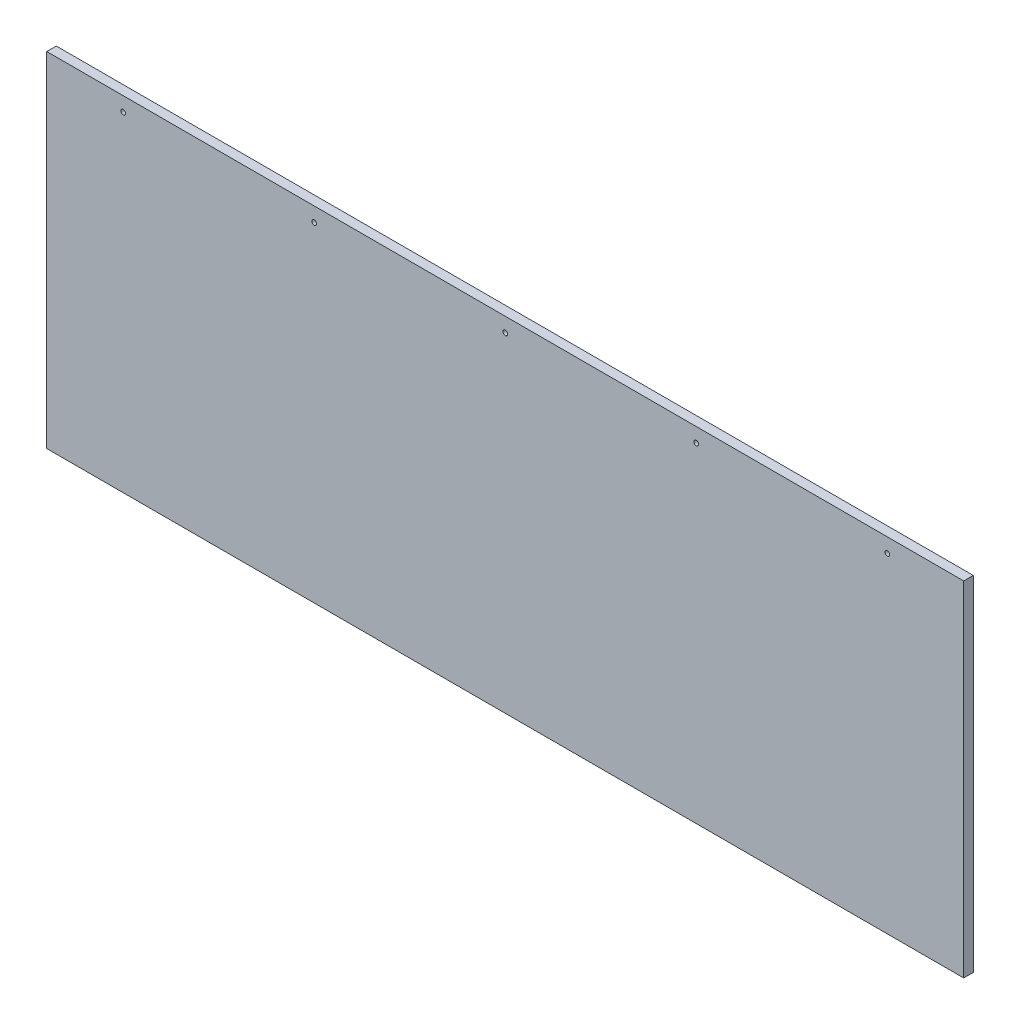
ISO-10303-21;
HEADER;
FILE_DESCRIPTION(('STEP AP214'),'2;1');
FILE_NAME('part.step','',(''),(''),'','','');
FILE_SCHEMA(('AUTOMOTIVE_DESIGN { 1 0 10303 214 1 1 1 1 }'));
ENDSEC;
DATA;
#1=APPLICATION_CONTEXT('core data for automotive mechanical design processes');
#2=APPLICATION_PROTOCOL_DEFINITION('international standard','automotive_design',2000,#1);
#3=PRODUCT_CONTEXT('',#1,'mechanical');
#4=PRODUCT('Part','Part','',(#3));
#5=PRODUCT_RELATED_PRODUCT_CATEGORY('part','',(#4));
#6=PRODUCT_DEFINITION_FORMATION('','',#4);
#7=PRODUCT_DEFINITION_CONTEXT('part definition',#1,'design');
#8=PRODUCT_DEFINITION('design','',#6,#7);
#9=PRODUCT_DEFINITION_SHAPE('','',#8);
#10=(LENGTH_UNIT() NAMED_UNIT(*) SI_UNIT(.MILLI.,.METRE.));
#11=(NAMED_UNIT(*) PLANE_ANGLE_UNIT() SI_UNIT($,.RADIAN.));
#12=(NAMED_UNIT(*) SI_UNIT($,.STERADIAN.) SOLID_ANGLE_UNIT());
#13=UNCERTAINTY_MEASURE_WITH_UNIT(LENGTH_MEASURE(1.E-05),#10,'distance_accuracy_value','');
#14=(GEOMETRIC_REPRESENTATION_CONTEXT(3) GLOBAL_UNCERTAINTY_ASSIGNED_CONTEXT((#13)) GLOBAL_UNIT_ASSIGNED_CONTEXT((#10,
#11,#12)) REPRESENTATION_CONTEXT('',''));
#15=CARTESIAN_POINT('',(0.,0.,0.));
#16=DIRECTION('',(0.,0.,1.));
#17=DIRECTION('',(1.,0.,0.));
#18=AXIS2_PLACEMENT_3D('',#15,#16,#17);
#19=CARTESIAN_POINT('',(0.,0.,12.7));
#20=DIRECTION('',(-1.,0.,0.));
#21=DIRECTION('',(0.,0.,1.));
#22=AXIS2_PLACEMENT_3D('',#19,#20,#21);
#23=PLANE('',#22);
#24=DIRECTION('',(0.,1.,0.));
#25=VECTOR('',#24,1.);
#26=CARTESIAN_POINT('',(0.,0.,0.));
#27=LINE('',#26,#25);
#28=CARTESIAN_POINT('',(0.,0.,0.));
#29=VERTEX_POINT('',#28);
#30=CARTESIAN_POINT('',(0.,457.2,0.));
#31=VERTEX_POINT('',#30);
#32=EDGE_CURVE('E106',#29,#31,#27,.T.);
#33=ORIENTED_EDGE('',*,*,#32,.T.);
#34=DIRECTION('',(0.,0.,-1.));
#35=VECTOR('',#34,1.);
#36=CARTESIAN_POINT('',(0.,457.2,12.7));
#37=LINE('',#36,#35);
#38=CARTESIAN_POINT('',(0.,457.2,12.7));
#39=VERTEX_POINT('',#38);
#40=EDGE_CURVE('E11',#39,#31,#37,.T.);
#41=ORIENTED_EDGE('',*,*,#40,.F.);
#42=DIRECTION('',(0.,1.,0.));
#43=VECTOR('',#42,1.);
#44=CARTESIAN_POINT('',(0.,0.,12.7));
#45=LINE('',#44,#43);
#46=CARTESIAN_POINT('',(0.,0.,12.7));
#47=VERTEX_POINT('',#46);
#48=EDGE_CURVE('E90',#47,#39,#45,.T.);
#49=ORIENTED_EDGE('',*,*,#48,.F.);
#50=DIRECTION('',(0.,0.,-1.));
#51=VECTOR('',#50,1.);
#52=CARTESIAN_POINT('',(0.,0.,12.7));
#53=LINE('',#52,#51);
#54=EDGE_CURVE('E102',#47,#29,#53,.T.);
#55=ORIENTED_EDGE('',*,*,#54,.T.);
#56=EDGE_LOOP('',(#33,#41,#49,#55));
#57=FACE_BOUND('',#56,.T.);
#58=ADVANCED_FACE('F38',(#57),#23,.F.);
#59=CARTESIAN_POINT('',(0.,457.2,12.7));
#60=DIRECTION('',(0.,-1.,0.));
#61=DIRECTION('',(1.,0.,0.));
#62=AXIS2_PLACEMENT_3D('',#59,#60,#61);
#63=PLANE('',#62);
#64=DIRECTION('',(-1.,0.,0.));
#65=VECTOR('',#64,1.);
#66=CARTESIAN_POINT('',(0.,457.2,0.));
#67=LINE('',#66,#65);
#68=CARTESIAN_POINT('',(-1219.2,457.2,0.));
#69=VERTEX_POINT('',#68);
#70=EDGE_CURVE('E95',#31,#69,#67,.T.);
#71=ORIENTED_EDGE('',*,*,#70,.T.);
#72=DIRECTION('',(0.,0.,-1.));
#73=VECTOR('',#72,1.);
#74=CARTESIAN_POINT('',(-1219.2,457.2,12.7));
#75=LINE('',#74,#73);
#76=CARTESIAN_POINT('',(-1219.2,457.2,12.7));
#77=VERTEX_POINT('',#76);
#78=EDGE_CURVE('E47',#77,#69,#75,.T.);
#79=ORIENTED_EDGE('',*,*,#78,.F.);
#80=DIRECTION('',(-1.,0.,0.));
#81=VECTOR('',#80,1.);
#82=CARTESIAN_POINT('',(0.,457.2,12.7));
#83=LINE('',#82,#81);
#84=EDGE_CURVE('E85',#39,#77,#83,.T.);
#85=ORIENTED_EDGE('',*,*,#84,.F.);
#86=ORIENTED_EDGE('',*,*,#40,.T.);
#87=EDGE_LOOP('',(#71,#79,#85,#86));
#88=FACE_BOUND('',#87,.T.);
#89=ADVANCED_FACE('F94',(#88),#63,.F.);
#90=CARTESIAN_POINT('',(-1219.2,-1.49308937752045E-13,12.7));
#91=DIRECTION('',(1.,0.,0.));
#92=DIRECTION('',(0.,1.,0.));
#93=AXIS2_PLACEMENT_3D('',#90,#91,#92);
#94=PLANE('',#93);
#95=DIRECTION('',(0.,-1.,0.));
#96=VECTOR('',#95,1.);
#97=CARTESIAN_POINT('',(-1219.2,-1.49308937752045E-13,0.));
#98=LINE('',#97,#96);
#99=CARTESIAN_POINT('',(-1219.2,-1.49308937752045E-13,0.));
#100=VERTEX_POINT('',#99);
#101=EDGE_CURVE('E72',#69,#100,#98,.T.);
#102=ORIENTED_EDGE('',*,*,#101,.T.);
#103=DIRECTION('',(0.,0.,-1.));
#104=VECTOR('',#103,1.);
#105=CARTESIAN_POINT('',(-1219.2,-1.49308937752045E-13,12.7));
#106=LINE('',#105,#104);
#107=CARTESIAN_POINT('',(-1219.2,-1.49308937752045E-13,12.7));
#108=VERTEX_POINT('',#107);
#109=EDGE_CURVE('E97',#108,#100,#106,.T.);
#110=ORIENTED_EDGE('',*,*,#109,.F.);
#111=DIRECTION('',(0.,-1.,0.));
#112=VECTOR('',#111,1.);
#113=CARTESIAN_POINT('',(-1219.2,-1.49308937752045E-13,12.7));
#114=LINE('',#113,#112);
#115=EDGE_CURVE('E88',#77,#108,#114,.T.);
#116=ORIENTED_EDGE('',*,*,#115,.F.);
#117=ORIENTED_EDGE('',*,*,#78,.T.);
#118=EDGE_LOOP('',(#102,#110,#116,#117));
#119=FACE_BOUND('',#118,.T.);
#120=ADVANCED_FACE('F98',(#119),#94,.F.);
#121=CARTESIAN_POINT('',(0.,0.,12.7));
#122=DIRECTION('',(0.,1.,0.));
#123=DIRECTION('',(-1.,0.,0.));
#124=AXIS2_PLACEMENT_3D('',#121,#122,#123);
#125=PLANE('',#124);
#126=DIRECTION('',(1.,0.,0.));
#127=VECTOR('',#126,1.);
#128=CARTESIAN_POINT('',(0.,0.,0.));
#129=LINE('',#128,#127);
#130=EDGE_CURVE('E78',#100,#29,#129,.T.);
#131=ORIENTED_EDGE('',*,*,#130,.T.);
#132=ORIENTED_EDGE('',*,*,#54,.F.);
#133=DIRECTION('',(1.,0.,0.));
#134=VECTOR('',#133,1.);
#135=CARTESIAN_POINT('',(0.,0.,12.7));
#136=LINE('',#135,#134);
#137=EDGE_CURVE('E55',#108,#47,#136,.T.);
#138=ORIENTED_EDGE('',*,*,#137,.F.);
#139=ORIENTED_EDGE('',*,*,#109,.T.);
#140=EDGE_LOOP('',(#131,#132,#138,#139));
#141=FACE_BOUND('',#140,.T.);
#142=ADVANCED_FACE('F120',(#141),#125,.F.);
#143=CARTESIAN_POINT('',(0.,0.,12.7));
#144=DIRECTION('',(0.,0.,1.));
#145=DIRECTION('',(1.,0.,0.));
#146=AXIS2_PLACEMENT_3D('',#143,#144,#145);
#147=PLANE('',#146);
#148=CARTESIAN_POINT('',(-1117.6,438.15,12.7));
#149=DIRECTION('',(0.,0.,1.));
#150=DIRECTION('',(1.,0.,0.));
#151=AXIS2_PLACEMENT_3D('',#148,#149,#150);
#152=CIRCLE('',#151,3.17499999999986);
#153=CARTESIAN_POINT('',(-1114.425,438.15,12.7));
#154=VERTEX_POINT('',#153);
#155=EDGE_CURVE('E159',#154,#154,#152,.T.);
#156=ORIENTED_EDGE('',*,*,#155,.F.);
#157=EDGE_LOOP('',(#156));
#158=FACE_BOUND('',#157,.T.);
#159=CARTESIAN_POINT('',(-863.6,438.15,12.7));
#160=DIRECTION('',(0.,0.,1.));
#161=DIRECTION('',(1.,0.,0.));
#162=AXIS2_PLACEMENT_3D('',#159,#160,#161);
#163=CIRCLE('',#162,3.17500000000008);
#164=CARTESIAN_POINT('',(-860.425,438.15,12.7));
#165=VERTEX_POINT('',#164);
#166=EDGE_CURVE('E151',#165,#165,#163,.T.);
#167=ORIENTED_EDGE('',*,*,#166,.F.);
#168=EDGE_LOOP('',(#167));
#169=FACE_BOUND('',#168,.T.);
#170=CARTESIAN_POINT('',(-609.6,438.15,12.7));
#171=DIRECTION('',(0.,0.,1.));
#172=DIRECTION('',(1.,0.,0.));
#173=AXIS2_PLACEMENT_3D('',#170,#171,#172);
#174=CIRCLE('',#173,3.17499999999997);
#175=CARTESIAN_POINT('',(-606.425,438.15,12.7));
#176=VERTEX_POINT('',#175);
#177=EDGE_CURVE('E143',#176,#176,#174,.T.);
#178=ORIENTED_EDGE('',*,*,#177,.F.);
#179=EDGE_LOOP('',(#178));
#180=FACE_BOUND('',#179,.T.);
#181=CARTESIAN_POINT('',(-355.6,438.15,12.7));
#182=DIRECTION('',(0.,0.,1.));
#183=DIRECTION('',(1.,0.,0.));
#184=AXIS2_PLACEMENT_3D('',#181,#182,#183);
#185=CIRCLE('',#184,3.17499999999997);
#186=CARTESIAN_POINT('',(-352.425,438.15,12.7));
#187=VERTEX_POINT('',#186);
#188=EDGE_CURVE('E135',#187,#187,#185,.T.);
#189=ORIENTED_EDGE('',*,*,#188,.F.);
#190=EDGE_LOOP('',(#189));
#191=FACE_BOUND('',#190,.T.);
#192=CARTESIAN_POINT('',(-101.6,438.15,12.7));
#193=DIRECTION('',(0.,0.,1.));
#194=DIRECTION('',(1.,0.,0.));
#195=AXIS2_PLACEMENT_3D('',#192,#193,#194);
#196=CIRCLE('',#195,3.17499999999997);
#197=CARTESIAN_POINT('',(-98.4250000000002,438.15,12.7));
#198=VERTEX_POINT('',#197);
#199=EDGE_CURVE('E127',#198,#198,#196,.T.);
#200=ORIENTED_EDGE('',*,*,#199,.F.);
#201=EDGE_LOOP('',(#200));
#202=FACE_BOUND('',#201,.T.);
#203=ORIENTED_EDGE('',*,*,#48,.T.);
#204=ORIENTED_EDGE('',*,*,#84,.T.);
#205=ORIENTED_EDGE('',*,*,#115,.T.);
#206=ORIENTED_EDGE('',*,*,#137,.T.);
#207=EDGE_LOOP('',(#203,#204,#205,#206));
#208=FACE_BOUND('',#207,.T.);
#209=ADVANCED_FACE('F86',(#158,#169,#180,#191,#202,#208),#147,.T.);
#210=CARTESIAN_POINT('',(0.,0.,0.));
#211=DIRECTION('',(0.,0.,1.));
#212=DIRECTION('',(1.,0.,0.));
#213=AXIS2_PLACEMENT_3D('',#210,#211,#212);
#214=PLANE('',#213);
#215=CARTESIAN_POINT('',(-1117.6,438.15,0.));
#216=DIRECTION('',(0.,0.,1.));
#217=DIRECTION('',(1.,0.,0.));
#218=AXIS2_PLACEMENT_3D('',#215,#216,#217);
#219=CIRCLE('',#218,3.17499999999986);
#220=CARTESIAN_POINT('',(-1114.425,438.15,0.));
#221=VERTEX_POINT('',#220);
#222=EDGE_CURVE('E110',#221,#221,#219,.T.);
#223=ORIENTED_EDGE('',*,*,#222,.T.);
#224=EDGE_LOOP('',(#223));
#225=FACE_BOUND('',#224,.T.);
#226=CARTESIAN_POINT('',(-863.6,438.15,0.));
#227=DIRECTION('',(0.,0.,1.));
#228=DIRECTION('',(1.,0.,0.));
#229=AXIS2_PLACEMENT_3D('',#226,#227,#228);
#230=CIRCLE('',#229,3.17500000000008);
#231=CARTESIAN_POINT('',(-860.425,438.15,0.));
#232=VERTEX_POINT('',#231);
#233=EDGE_CURVE('E155',#232,#232,#230,.T.);
#234=ORIENTED_EDGE('',*,*,#233,.T.);
#235=EDGE_LOOP('',(#234));
#236=FACE_BOUND('',#235,.T.);
#237=CARTESIAN_POINT('',(-609.6,438.15,0.));
#238=DIRECTION('',(0.,0.,1.));
#239=DIRECTION('',(1.,0.,0.));
#240=AXIS2_PLACEMENT_3D('',#237,#238,#239);
#241=CIRCLE('',#240,3.17499999999997);
#242=CARTESIAN_POINT('',(-606.425,438.15,0.));
#243=VERTEX_POINT('',#242);
#244=EDGE_CURVE('E147',#243,#243,#241,.T.);
#245=ORIENTED_EDGE('',*,*,#244,.T.);
#246=EDGE_LOOP('',(#245));
#247=FACE_BOUND('',#246,.T.);
#248=CARTESIAN_POINT('',(-355.6,438.15,0.));
#249=DIRECTION('',(0.,0.,1.));
#250=DIRECTION('',(1.,0.,0.));
#251=AXIS2_PLACEMENT_3D('',#248,#249,#250);
#252=CIRCLE('',#251,3.17499999999997);
#253=CARTESIAN_POINT('',(-352.425,438.15,0.));
#254=VERTEX_POINT('',#253);
#255=EDGE_CURVE('E139',#254,#254,#252,.T.);
#256=ORIENTED_EDGE('',*,*,#255,.T.);
#257=EDGE_LOOP('',(#256));
#258=FACE_BOUND('',#257,.T.);
#259=CARTESIAN_POINT('',(-101.6,438.15,0.));
#260=DIRECTION('',(0.,0.,1.));
#261=DIRECTION('',(1.,0.,0.));
#262=AXIS2_PLACEMENT_3D('',#259,#260,#261);
#263=CIRCLE('',#262,3.17499999999997);
#264=CARTESIAN_POINT('',(-98.4250000000002,438.15,0.));
#265=VERTEX_POINT('',#264);
#266=EDGE_CURVE('E131',#265,#265,#263,.T.);
#267=ORIENTED_EDGE('',*,*,#266,.T.);
#268=EDGE_LOOP('',(#267));
#269=FACE_BOUND('',#268,.T.);
#270=ORIENTED_EDGE('',*,*,#32,.F.);
#271=ORIENTED_EDGE('',*,*,#130,.F.);
#272=ORIENTED_EDGE('',*,*,#101,.F.);
#273=ORIENTED_EDGE('',*,*,#70,.F.);
#274=EDGE_LOOP('',(#270,#271,#272,#273));
#275=FACE_BOUND('',#274,.T.);
#276=ADVANCED_FACE('F123',(#225,#236,#247,#258,#269,#275),#214,.F.);
#277=CARTESIAN_POINT('',(-101.6,438.15,0.));
#278=DIRECTION('',(0.,0.,1.));
#279=DIRECTION('',(1.,0.,0.));
#280=AXIS2_PLACEMENT_3D('',#277,#278,#279);
#281=CYLINDRICAL_SURFACE('',#280,3.17499999999997);
#282=ORIENTED_EDGE('',*,*,#266,.F.);
#283=EDGE_LOOP('',(#282));
#284=FACE_BOUND('',#283,.T.);
#285=ORIENTED_EDGE('',*,*,#199,.T.);
#286=EDGE_LOOP('',(#285));
#287=FACE_BOUND('',#286,.T.);
#288=ADVANCED_FACE('F187',(#284,#287),#281,.F.);
#289=CARTESIAN_POINT('',(-355.6,438.15,0.));
#290=DIRECTION('',(0.,0.,1.));
#291=DIRECTION('',(1.,0.,0.));
#292=AXIS2_PLACEMENT_3D('',#289,#290,#291);
#293=CYLINDRICAL_SURFACE('',#292,3.17499999999997);
#294=ORIENTED_EDGE('',*,*,#255,.F.);
#295=EDGE_LOOP('',(#294));
#296=FACE_BOUND('',#295,.T.);
#297=ORIENTED_EDGE('',*,*,#188,.T.);
#298=EDGE_LOOP('',(#297));
#299=FACE_BOUND('',#298,.T.);
#300=ADVANCED_FACE('F189',(#296,#299),#293,.F.);
#301=CARTESIAN_POINT('',(-609.6,438.15,0.));
#302=DIRECTION('',(0.,0.,1.));
#303=DIRECTION('',(1.,0.,0.));
#304=AXIS2_PLACEMENT_3D('',#301,#302,#303);
#305=CYLINDRICAL_SURFACE('',#304,3.17499999999997);
#306=ORIENTED_EDGE('',*,*,#244,.F.);
#307=EDGE_LOOP('',(#306));
#308=FACE_BOUND('',#307,.T.);
#309=ORIENTED_EDGE('',*,*,#177,.T.);
#310=EDGE_LOOP('',(#309));
#311=FACE_BOUND('',#310,.T.);
#312=ADVANCED_FACE('F196',(#308,#311),#305,.F.);
#313=CARTESIAN_POINT('',(-863.6,438.15,0.));
#314=DIRECTION('',(0.,0.,1.));
#315=DIRECTION('',(1.,0.,0.));
#316=AXIS2_PLACEMENT_3D('',#313,#314,#315);
#317=CYLINDRICAL_SURFACE('',#316,3.17500000000008);
#318=ORIENTED_EDGE('',*,*,#233,.F.);
#319=EDGE_LOOP('',(#318));
#320=FACE_BOUND('',#319,.T.);
#321=ORIENTED_EDGE('',*,*,#166,.T.);
#322=EDGE_LOOP('',(#321));
#323=FACE_BOUND('',#322,.T.);
#324=ADVANCED_FACE('F172',(#320,#323),#317,.F.);
#325=CARTESIAN_POINT('',(-1117.6,438.15,0.));
#326=DIRECTION('',(0.,0.,1.));
#327=DIRECTION('',(1.,0.,0.));
#328=AXIS2_PLACEMENT_3D('',#325,#326,#327);
#329=CYLINDRICAL_SURFACE('',#328,3.17499999999986);
#330=ORIENTED_EDGE('',*,*,#222,.F.);
#331=EDGE_LOOP('',(#330));
#332=FACE_BOUND('',#331,.T.);
#333=ORIENTED_EDGE('',*,*,#155,.T.);
#334=EDGE_LOOP('',(#333));
#335=FACE_BOUND('',#334,.T.);
#336=ADVANCED_FACE('F169',(#332,#335),#329,.F.);
#337=CLOSED_SHELL('',(#58,#89,#120,#142,#209,#276,#288,#300,#312,#324,#336));
#338=MANIFOLD_SOLID_BREP('B2',#337);
#339=ADVANCED_BREP_SHAPE_REPRESENTATION('',(#18,#338),#14);
#340=SHAPE_DEFINITION_REPRESENTATION(#9,#339);
ENDSEC;
END-ISO-10303-21;
